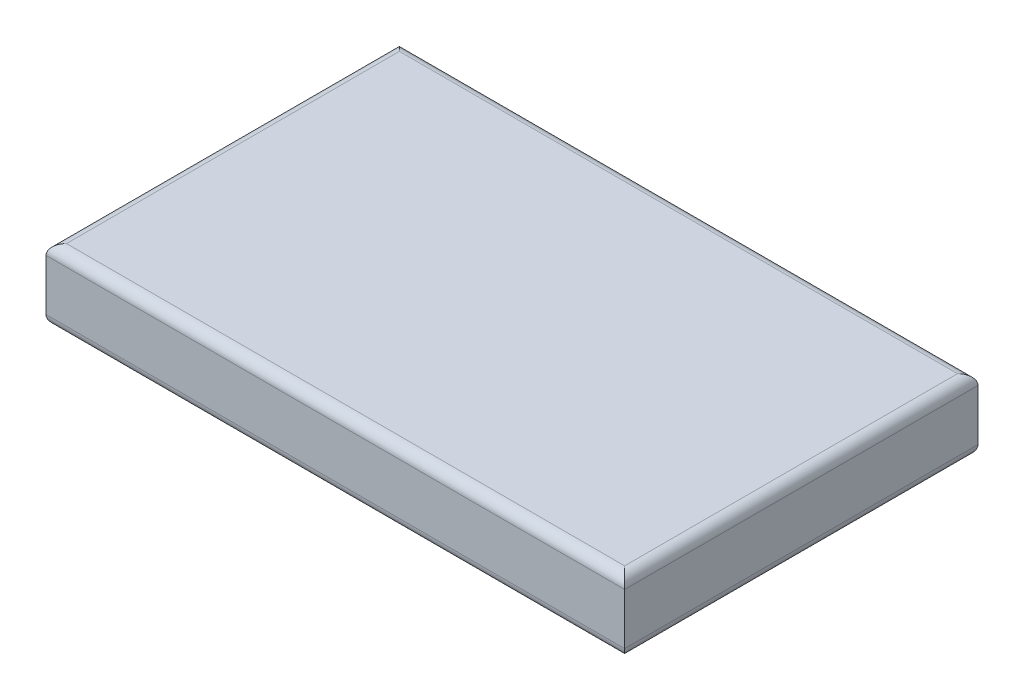
ISO-10303-21;
HEADER;
FILE_DESCRIPTION(('STEP AP214'),'2;1');
FILE_NAME('part.step','',(''),(''),'','','');
FILE_SCHEMA(('AUTOMOTIVE_DESIGN { 1 0 10303 214 1 1 1 1 }'));
ENDSEC;
DATA;
#1=APPLICATION_CONTEXT('core data for automotive mechanical design processes');
#2=APPLICATION_PROTOCOL_DEFINITION('international standard','automotive_design',2000,#1);
#3=PRODUCT_CONTEXT('',#1,'mechanical');
#4=PRODUCT('Part','Part','',(#3));
#5=PRODUCT_RELATED_PRODUCT_CATEGORY('part','',(#4));
#6=PRODUCT_DEFINITION_FORMATION('','',#4);
#7=PRODUCT_DEFINITION_CONTEXT('part definition',#1,'design');
#8=PRODUCT_DEFINITION('design','',#6,#7);
#9=PRODUCT_DEFINITION_SHAPE('','',#8);
#10=(LENGTH_UNIT() NAMED_UNIT(*) SI_UNIT(.MILLI.,.METRE.));
#11=(NAMED_UNIT(*) PLANE_ANGLE_UNIT() SI_UNIT($,.RADIAN.));
#12=(NAMED_UNIT(*) SI_UNIT($,.STERADIAN.) SOLID_ANGLE_UNIT());
#13=UNCERTAINTY_MEASURE_WITH_UNIT(LENGTH_MEASURE(1.E-05),#10,'distance_accuracy_value','');
#14=(GEOMETRIC_REPRESENTATION_CONTEXT(3) GLOBAL_UNCERTAINTY_ASSIGNED_CONTEXT((#13)) GLOBAL_UNIT_ASSIGNED_CONTEXT((#10,
#11,#12)) REPRESENTATION_CONTEXT('',''));
#15=CARTESIAN_POINT('',(0.,0.,0.));
#16=DIRECTION('',(0.,0.,1.));
#17=DIRECTION('',(1.,0.,0.));
#18=AXIS2_PLACEMENT_3D('',#15,#16,#17);
#19=CARTESIAN_POINT('',(0.,7.,0.));
#20=DIRECTION('',(1.,0.,0.));
#21=DIRECTION('',(0.,0.,-1.));
#22=AXIS2_PLACEMENT_3D('',#19,#20,#21);
#23=PLANE('',#22);
#24=DIRECTION('',(0.,-1.,0.));
#25=VECTOR('',#24,1.);
#26=CARTESIAN_POINT('',(0.,7.,0.));
#27=LINE('',#26,#25);
#28=CARTESIAN_POINT('',(0.,6.,0.));
#29=VERTEX_POINT('',#28);
#30=CARTESIAN_POINT('',(0.,1.,0.));
#31=VERTEX_POINT('',#30);
#32=EDGE_CURVE('E129',#29,#31,#27,.T.);
#33=ORIENTED_EDGE('',*,*,#32,.F.);
#34=DIRECTION('',(0.,0.,1.));
#35=VECTOR('',#34,1.);
#36=CARTESIAN_POINT('',(0.,6.,0.));
#37=LINE('',#36,#35);
#38=CARTESIAN_POINT('',(0.,6.,-34.5));
#39=VERTEX_POINT('',#38);
#40=EDGE_CURVE('E114',#29,#39,#37,.F.);
#41=ORIENTED_EDGE('',*,*,#40,.T.);
#42=DIRECTION('',(0.,-1.,0.));
#43=VECTOR('',#42,1.);
#44=CARTESIAN_POINT('',(0.,7.,-34.5));
#45=LINE('',#44,#43);
#46=CARTESIAN_POINT('',(0.,1.,-34.5));
#47=VERTEX_POINT('',#46);
#48=EDGE_CURVE('E181',#39,#47,#45,.T.);
#49=ORIENTED_EDGE('',*,*,#48,.T.);
#50=DIRECTION('',(0.,0.,1.));
#51=VECTOR('',#50,1.);
#52=CARTESIAN_POINT('',(0.,1.,0.));
#53=LINE('',#52,#51);
#54=EDGE_CURVE('E136',#47,#31,#53,.T.);
#55=ORIENTED_EDGE('',*,*,#54,.T.);
#56=EDGE_LOOP('',(#33,#41,#49,#55));
#57=FACE_BOUND('',#56,.T.);
#58=ADVANCED_FACE('F39',(#57),#23,.F.);
#59=CARTESIAN_POINT('',(0.,7.,0.));
#60=DIRECTION('',(0.,0.,-1.));
#61=DIRECTION('',(-1.,0.,0.));
#62=AXIS2_PLACEMENT_3D('',#59,#60,#61);
#63=PLANE('',#62);
#64=ORIENTED_EDGE('',*,*,#32,.T.);
#65=DIRECTION('',(1.,0.,0.));
#66=VECTOR('',#65,1.);
#67=CARTESIAN_POINT('',(56.5,1.,0.));
#68=LINE('',#67,#66);
#69=CARTESIAN_POINT('',(56.5,1.,0.));
#70=VERTEX_POINT('',#69);
#71=EDGE_CURVE('E11',#31,#70,#68,.T.);
#72=ORIENTED_EDGE('',*,*,#71,.T.);
#73=DIRECTION('',(0.,-1.,0.));
#74=VECTOR('',#73,1.);
#75=CARTESIAN_POINT('',(56.5,7.,0.));
#76=LINE('',#75,#74);
#77=CARTESIAN_POINT('',(56.5,6.,0.));
#78=VERTEX_POINT('',#77);
#79=EDGE_CURVE('E218',#78,#70,#76,.T.);
#80=ORIENTED_EDGE('',*,*,#79,.F.);
#81=DIRECTION('',(1.,0.,0.));
#82=VECTOR('',#81,1.);
#83=CARTESIAN_POINT('',(0.,6.,0.));
#84=LINE('',#83,#82);
#85=EDGE_CURVE('E49',#78,#29,#84,.F.);
#86=ORIENTED_EDGE('',*,*,#85,.T.);
#87=EDGE_LOOP('',(#64,#72,#80,#86));
#88=FACE_BOUND('',#87,.T.);
#89=ADVANCED_FACE('F216',(#88),#63,.F.);
#90=CARTESIAN_POINT('',(56.5,7.,0.));
#91=DIRECTION('',(-1.,0.,0.));
#92=DIRECTION('',(0.,0.,1.));
#93=AXIS2_PLACEMENT_3D('',#90,#91,#92);
#94=PLANE('',#93);
#95=ORIENTED_EDGE('',*,*,#79,.T.);
#96=DIRECTION('',(0.,0.,-1.));
#97=VECTOR('',#96,1.);
#98=CARTESIAN_POINT('',(56.5,1.,-34.5));
#99=LINE('',#98,#97);
#100=CARTESIAN_POINT('',(56.5,1.,-34.5));
#101=VERTEX_POINT('',#100);
#102=EDGE_CURVE('E168',#70,#101,#99,.T.);
#103=ORIENTED_EDGE('',*,*,#102,.T.);
#104=DIRECTION('',(0.,-1.,0.));
#105=VECTOR('',#104,1.);
#106=CARTESIAN_POINT('',(56.5,7.,-34.5));
#107=LINE('',#106,#105);
#108=CARTESIAN_POINT('',(56.5,6.,-34.5));
#109=VERTEX_POINT('',#108);
#110=EDGE_CURVE('E221',#109,#101,#107,.T.);
#111=ORIENTED_EDGE('',*,*,#110,.F.);
#112=DIRECTION('',(0.,0.,-1.));
#113=VECTOR('',#112,1.);
#114=CARTESIAN_POINT('',(56.5,6.,0.));
#115=LINE('',#114,#113);
#116=EDGE_CURVE('E62',#109,#78,#115,.F.);
#117=ORIENTED_EDGE('',*,*,#116,.T.);
#118=EDGE_LOOP('',(#95,#103,#111,#117));
#119=FACE_BOUND('',#118,.T.);
#120=ADVANCED_FACE('F237',(#119),#94,.F.);
#121=CARTESIAN_POINT('',(0.,7.,-34.5));
#122=DIRECTION('',(0.,0.,1.));
#123=DIRECTION('',(1.,0.,0.));
#124=AXIS2_PLACEMENT_3D('',#121,#122,#123);
#125=PLANE('',#124);
#126=ORIENTED_EDGE('',*,*,#48,.F.);
#127=DIRECTION('',(-1.,0.,0.));
#128=VECTOR('',#127,1.);
#129=CARTESIAN_POINT('',(0.,6.,-34.5));
#130=LINE('',#129,#128);
#131=EDGE_CURVE('E163',#39,#109,#130,.F.);
#132=ORIENTED_EDGE('',*,*,#131,.T.);
#133=ORIENTED_EDGE('',*,*,#110,.T.);
#134=DIRECTION('',(-1.,0.,0.));
#135=VECTOR('',#134,1.);
#136=CARTESIAN_POINT('',(0.,1.,-34.5));
#137=LINE('',#136,#135);
#138=EDGE_CURVE('E160',#101,#47,#137,.T.);
#139=ORIENTED_EDGE('',*,*,#138,.T.);
#140=EDGE_LOOP('',(#126,#132,#133,#139));
#141=FACE_BOUND('',#140,.T.);
#142=ADVANCED_FACE('F233',(#141),#125,.F.);
#143=CARTESIAN_POINT('',(0.,7.,0.));
#144=DIRECTION('',(0.,-1.,0.));
#145=DIRECTION('',(0.,0.,-1.));
#146=AXIS2_PLACEMENT_3D('',#143,#144,#145);
#147=PLANE('',#146);
#148=DIRECTION('',(-1.,0.,0.));
#149=VECTOR('',#148,1.);
#150=CARTESIAN_POINT('',(0.,7.,-33.5));
#151=LINE('',#150,#149);
#152=CARTESIAN_POINT('',(55.5,7.,-33.5));
#153=VERTEX_POINT('',#152);
#154=CARTESIAN_POINT('',(1.,7.,-33.5));
#155=VERTEX_POINT('',#154);
#156=EDGE_CURVE('E133',#153,#155,#151,.T.);
#157=ORIENTED_EDGE('',*,*,#156,.T.);
#158=DIRECTION('',(0.,0.,1.));
#159=VECTOR('',#158,1.);
#160=CARTESIAN_POINT('',(1.,7.,0.));
#161=LINE('',#160,#159);
#162=CARTESIAN_POINT('',(1.,7.,-1.));
#163=VERTEX_POINT('',#162);
#164=EDGE_CURVE('E112',#155,#163,#161,.T.);
#165=ORIENTED_EDGE('',*,*,#164,.T.);
#166=DIRECTION('',(1.,0.,0.));
#167=VECTOR('',#166,1.);
#168=CARTESIAN_POINT('',(0.,7.,-1.));
#169=LINE('',#168,#167);
#170=CARTESIAN_POINT('',(55.5,7.,-1.));
#171=VERTEX_POINT('',#170);
#172=EDGE_CURVE('E121',#163,#171,#169,.T.);
#173=ORIENTED_EDGE('',*,*,#172,.T.);
#174=DIRECTION('',(0.,0.,-1.));
#175=VECTOR('',#174,1.);
#176=CARTESIAN_POINT('',(55.5,7.,0.));
#177=LINE('',#176,#175);
#178=EDGE_CURVE('E128',#171,#153,#177,.T.);
#179=ORIENTED_EDGE('',*,*,#178,.T.);
#180=EDGE_LOOP('',(#157,#165,#173,#179));
#181=FACE_BOUND('',#180,.T.);
#182=ADVANCED_FACE('F131',(#181),#147,.F.);
#183=CARTESIAN_POINT('',(0.,0.,0.));
#184=DIRECTION('',(0.,-1.,0.));
#185=DIRECTION('',(0.,0.,-1.));
#186=AXIS2_PLACEMENT_3D('',#183,#184,#185);
#187=PLANE('',#186);
#188=DIRECTION('',(1.,0.,0.));
#189=VECTOR('',#188,1.);
#190=CARTESIAN_POINT('',(0.,0.,-1.));
#191=LINE('',#190,#189);
#192=CARTESIAN_POINT('',(55.5,0.,-1.));
#193=VERTEX_POINT('',#192);
#194=CARTESIAN_POINT('',(1.,0.,-1.));
#195=VERTEX_POINT('',#194);
#196=EDGE_CURVE('E147',#193,#195,#191,.F.);
#197=ORIENTED_EDGE('',*,*,#196,.T.);
#198=DIRECTION('',(0.,0.,1.));
#199=VECTOR('',#198,1.);
#200=CARTESIAN_POINT('',(1.,0.,-34.5));
#201=LINE('',#200,#199);
#202=CARTESIAN_POINT('',(1.,0.,-33.5));
#203=VERTEX_POINT('',#202);
#204=EDGE_CURVE('E156',#195,#203,#201,.F.);
#205=ORIENTED_EDGE('',*,*,#204,.T.);
#206=DIRECTION('',(-1.,0.,0.));
#207=VECTOR('',#206,1.);
#208=CARTESIAN_POINT('',(56.5,0.,-33.5));
#209=LINE('',#208,#207);
#210=CARTESIAN_POINT('',(55.5,0.,-33.5));
#211=VERTEX_POINT('',#210);
#212=EDGE_CURVE('E153',#203,#211,#209,.F.);
#213=ORIENTED_EDGE('',*,*,#212,.T.);
#214=DIRECTION('',(0.,0.,-1.));
#215=VECTOR('',#214,1.);
#216=CARTESIAN_POINT('',(55.5,0.,0.));
#217=LINE('',#216,#215);
#218=EDGE_CURVE('E150',#211,#193,#217,.F.);
#219=ORIENTED_EDGE('',*,*,#218,.T.);
#220=EDGE_LOOP('',(#197,#205,#213,#219));
#221=FACE_BOUND('',#220,.T.);
#222=ADVANCED_FACE('F205',(#221),#187,.T.);
#223=CARTESIAN_POINT('',(55.5,6.,0.));
#224=DIRECTION('',(0.,0.,-1.));
#225=DIRECTION('',(-1.,0.,0.));
#226=AXIS2_PLACEMENT_3D('',#223,#224,#225);
#227=CYLINDRICAL_SURFACE('',#226,1.);
#228=CARTESIAN_POINT('',(55.5,6.,-1.));
#229=DIRECTION('',(0.707106781186547,0.,-0.707106781186547));
#230=DIRECTION('',(0.707106781186547,0.,0.707106781186547));
#231=AXIS2_PLACEMENT_3D('',#228,#229,#230);
#232=ELLIPSE('',#231,1.41421356237309,1.);
#233=EDGE_CURVE('E124',#78,#171,#232,.F.);
#234=ORIENTED_EDGE('',*,*,#233,.F.);
#235=ORIENTED_EDGE('',*,*,#116,.F.);
#236=CARTESIAN_POINT('',(55.5,6.,-33.5));
#237=DIRECTION('',(-0.707106781186547,0.,-0.707106781186547));
#238=DIRECTION('',(0.707106781186547,0.,-0.707106781186547));
#239=AXIS2_PLACEMENT_3D('',#236,#237,#238);
#240=ELLIPSE('',#239,1.41421356237309,1.);
#241=EDGE_CURVE('E177',#153,#109,#240,.T.);
#242=ORIENTED_EDGE('',*,*,#241,.F.);
#243=ORIENTED_EDGE('',*,*,#178,.F.);
#244=EDGE_LOOP('',(#234,#235,#242,#243));
#245=FACE_BOUND('',#244,.T.);
#246=ADVANCED_FACE('F227',(#245),#227,.T.);
#247=CARTESIAN_POINT('',(0.,6.,-33.5));
#248=DIRECTION('',(-1.,0.,0.));
#249=DIRECTION('',(0.,0.,1.));
#250=AXIS2_PLACEMENT_3D('',#247,#248,#249);
#251=CYLINDRICAL_SURFACE('',#250,1.);
#252=ORIENTED_EDGE('',*,*,#241,.T.);
#253=ORIENTED_EDGE('',*,*,#131,.F.);
#254=CARTESIAN_POINT('',(1.,6.,-33.5));
#255=DIRECTION('',(-0.707106781186547,0.,0.707106781186547));
#256=DIRECTION('',(-0.707106781186547,0.,-0.707106781186547));
#257=AXIS2_PLACEMENT_3D('',#254,#255,#256);
#258=ELLIPSE('',#257,1.41421356237309,1.);
#259=EDGE_CURVE('E118',#155,#39,#258,.T.);
#260=ORIENTED_EDGE('',*,*,#259,.F.);
#261=ORIENTED_EDGE('',*,*,#156,.F.);
#262=EDGE_LOOP('',(#252,#253,#260,#261));
#263=FACE_BOUND('',#262,.T.);
#264=ADVANCED_FACE('F230',(#263),#251,.T.);
#265=CARTESIAN_POINT('',(0.,6.,-1.));
#266=DIRECTION('',(1.,0.,0.));
#267=DIRECTION('',(0.,0.,-1.));
#268=AXIS2_PLACEMENT_3D('',#265,#266,#267);
#269=CYLINDRICAL_SURFACE('',#268,1.);
#270=ORIENTED_EDGE('',*,*,#233,.T.);
#271=ORIENTED_EDGE('',*,*,#172,.F.);
#272=CARTESIAN_POINT('',(1.,6.,-1.));
#273=DIRECTION('',(0.707106781186547,0.,0.707106781186547));
#274=DIRECTION('',(0.707106781186547,0.,-0.707106781186547));
#275=AXIS2_PLACEMENT_3D('',#272,#273,#274);
#276=ELLIPSE('',#275,1.41421356237309,1.);
#277=EDGE_CURVE('E108',#29,#163,#276,.F.);
#278=ORIENTED_EDGE('',*,*,#277,.F.);
#279=ORIENTED_EDGE('',*,*,#85,.F.);
#280=EDGE_LOOP('',(#270,#271,#278,#279));
#281=FACE_BOUND('',#280,.T.);
#282=ADVANCED_FACE('F122',(#281),#269,.T.);
#283=CARTESIAN_POINT('',(1.,6.,0.));
#284=DIRECTION('',(0.,0.,1.));
#285=DIRECTION('',(1.,0.,0.));
#286=AXIS2_PLACEMENT_3D('',#283,#284,#285);
#287=CYLINDRICAL_SURFACE('',#286,1.);
#288=ORIENTED_EDGE('',*,*,#259,.T.);
#289=ORIENTED_EDGE('',*,*,#40,.F.);
#290=ORIENTED_EDGE('',*,*,#277,.T.);
#291=ORIENTED_EDGE('',*,*,#164,.F.);
#292=EDGE_LOOP('',(#288,#289,#290,#291));
#293=FACE_BOUND('',#292,.T.);
#294=ADVANCED_FACE('F110',(#293),#287,.T.);
#295=CARTESIAN_POINT('',(55.5,1.,0.));
#296=DIRECTION('',(0.,0.,1.));
#297=DIRECTION('',(1.,0.,0.));
#298=AXIS2_PLACEMENT_3D('',#295,#296,#297);
#299=CYLINDRICAL_SURFACE('',#298,1.);
#300=CARTESIAN_POINT('',(55.5,1.,-1.));
#301=DIRECTION('',(-0.707106781186547,0.,0.707106781186547));
#302=DIRECTION('',(-0.707106781186547,0.,-0.707106781186547));
#303=AXIS2_PLACEMENT_3D('',#300,#301,#302);
#304=ELLIPSE('',#303,1.41421356237309,1.);
#305=EDGE_CURVE('E187',#193,#70,#304,.T.);
#306=ORIENTED_EDGE('',*,*,#305,.F.);
#307=ORIENTED_EDGE('',*,*,#218,.F.);
#308=CARTESIAN_POINT('',(55.5,1.,-33.5));
#309=DIRECTION('',(0.707106781186547,0.,0.707106781186547));
#310=DIRECTION('',(-0.707106781186547,0.,0.707106781186547));
#311=AXIS2_PLACEMENT_3D('',#308,#309,#310);
#312=ELLIPSE('',#311,1.41421356237309,1.);
#313=EDGE_CURVE('E43',#101,#211,#312,.F.);
#314=ORIENTED_EDGE('',*,*,#313,.F.);
#315=ORIENTED_EDGE('',*,*,#102,.F.);
#316=EDGE_LOOP('',(#306,#307,#314,#315));
#317=FACE_BOUND('',#316,.T.);
#318=ADVANCED_FACE('F41',(#317),#299,.T.);
#319=CARTESIAN_POINT('',(0.,1.,-33.5));
#320=DIRECTION('',(1.,0.,0.));
#321=DIRECTION('',(0.,0.,-1.));
#322=AXIS2_PLACEMENT_3D('',#319,#320,#321);
#323=CYLINDRICAL_SURFACE('',#322,1.);
#324=ORIENTED_EDGE('',*,*,#313,.T.);
#325=ORIENTED_EDGE('',*,*,#212,.F.);
#326=CARTESIAN_POINT('',(1.,1.,-33.5));
#327=DIRECTION('',(0.707106781186547,0.,-0.707106781186547));
#328=DIRECTION('',(0.707106781186547,0.,0.707106781186547));
#329=AXIS2_PLACEMENT_3D('',#326,#327,#328);
#330=ELLIPSE('',#329,1.41421356237309,1.);
#331=EDGE_CURVE('E185',#47,#203,#330,.F.);
#332=ORIENTED_EDGE('',*,*,#331,.F.);
#333=ORIENTED_EDGE('',*,*,#138,.F.);
#334=EDGE_LOOP('',(#324,#325,#332,#333));
#335=FACE_BOUND('',#334,.T.);
#336=ADVANCED_FACE('F199',(#335),#323,.T.);
#337=CARTESIAN_POINT('',(0.,1.,-1.));
#338=DIRECTION('',(-1.,0.,0.));
#339=DIRECTION('',(0.,0.,1.));
#340=AXIS2_PLACEMENT_3D('',#337,#338,#339);
#341=CYLINDRICAL_SURFACE('',#340,1.);
#342=ORIENTED_EDGE('',*,*,#305,.T.);
#343=ORIENTED_EDGE('',*,*,#71,.F.);
#344=CARTESIAN_POINT('',(1.,1.,-1.));
#345=DIRECTION('',(-0.707106781186547,0.,-0.707106781186547));
#346=DIRECTION('',(-0.707106781186547,0.,0.707106781186547));
#347=AXIS2_PLACEMENT_3D('',#344,#345,#346);
#348=ELLIPSE('',#347,1.41421356237309,1.);
#349=EDGE_CURVE('E182',#195,#31,#348,.T.);
#350=ORIENTED_EDGE('',*,*,#349,.F.);
#351=ORIENTED_EDGE('',*,*,#196,.F.);
#352=EDGE_LOOP('',(#342,#343,#350,#351));
#353=FACE_BOUND('',#352,.T.);
#354=ADVANCED_FACE('F211',(#353),#341,.T.);
#355=CARTESIAN_POINT('',(1.,1.,0.));
#356=DIRECTION('',(0.,0.,-1.));
#357=DIRECTION('',(-1.,0.,0.));
#358=AXIS2_PLACEMENT_3D('',#355,#356,#357);
#359=CYLINDRICAL_SURFACE('',#358,1.);
#360=ORIENTED_EDGE('',*,*,#331,.T.);
#361=ORIENTED_EDGE('',*,*,#204,.F.);
#362=ORIENTED_EDGE('',*,*,#349,.T.);
#363=ORIENTED_EDGE('',*,*,#54,.F.);
#364=EDGE_LOOP('',(#360,#361,#362,#363));
#365=FACE_BOUND('',#364,.T.);
#366=ADVANCED_FACE('F209',(#365),#359,.T.);
#367=CLOSED_SHELL('',(#58,#89,#120,#142,#182,#222,#246,#264,#282,#294,#318,#336,#354,#366));
#368=MANIFOLD_SOLID_BREP('B2',#367);
#369=ADVANCED_BREP_SHAPE_REPRESENTATION('',(#18,#368),#14);
#370=SHAPE_DEFINITION_REPRESENTATION(#9,#369);
ENDSEC;
END-ISO-10303-21;
